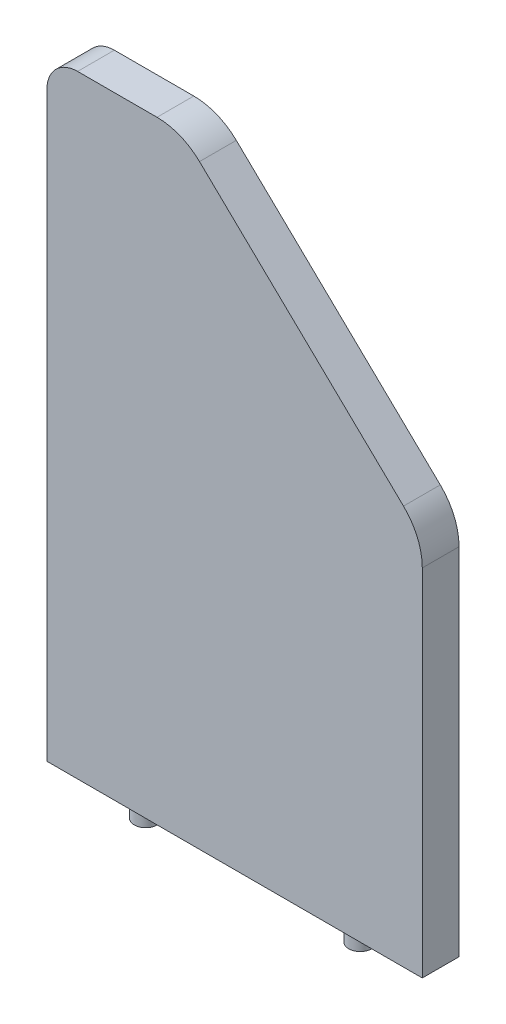
ISO-10303-21;
HEADER;
FILE_DESCRIPTION(('STEP AP214'),'2;1');
FILE_NAME('part.step','',(''),(''),'','','');
FILE_SCHEMA(('AUTOMOTIVE_DESIGN { 1 0 10303 214 1 1 1 1 }'));
ENDSEC;
DATA;
#1=APPLICATION_CONTEXT('core data for automotive mechanical design processes');
#2=APPLICATION_PROTOCOL_DEFINITION('international standard','automotive_design',2000,#1);
#3=PRODUCT_CONTEXT('',#1,'mechanical');
#4=PRODUCT('Part','Part','',(#3));
#5=PRODUCT_RELATED_PRODUCT_CATEGORY('part','',(#4));
#6=PRODUCT_DEFINITION_FORMATION('','',#4);
#7=PRODUCT_DEFINITION_CONTEXT('part definition',#1,'design');
#8=PRODUCT_DEFINITION('design','',#6,#7);
#9=PRODUCT_DEFINITION_SHAPE('','',#8);
#10=(LENGTH_UNIT() NAMED_UNIT(*) SI_UNIT(.MILLI.,.METRE.));
#11=(NAMED_UNIT(*) PLANE_ANGLE_UNIT() SI_UNIT($,.RADIAN.));
#12=(NAMED_UNIT(*) SI_UNIT($,.STERADIAN.) SOLID_ANGLE_UNIT());
#13=UNCERTAINTY_MEASURE_WITH_UNIT(LENGTH_MEASURE(1.E-05),#10,'distance_accuracy_value','');
#14=(GEOMETRIC_REPRESENTATION_CONTEXT(3) GLOBAL_UNCERTAINTY_ASSIGNED_CONTEXT((#13)) GLOBAL_UNIT_ASSIGNED_CONTEXT((#10,
#11,#12)) REPRESENTATION_CONTEXT('',''));
#15=CARTESIAN_POINT('',(0.,0.,0.));
#16=DIRECTION('',(0.,0.,1.));
#17=DIRECTION('',(1.,0.,0.));
#18=AXIS2_PLACEMENT_3D('',#15,#16,#17);
#19=CARTESIAN_POINT('',(5.65255069977418,8.93097875919951,11.4));
#20=DIRECTION('',(0.,1.,0.));
#21=DIRECTION('',(0.,0.,1.));
#22=AXIS2_PLACEMENT_3D('',#19,#20,#21);
#23=PLANE('',#22);
#24=CARTESIAN_POINT('',(29.2775506997742,8.93097875919951,6.));
#25=DIRECTION('',(0.,1.,0.));
#26=DIRECTION('',(0.,0.,1.));
#27=AXIS2_PLACEMENT_3D('',#24,#25,#26);
#28=CIRCLE('',#27,3.375);
#29=CARTESIAN_POINT('',(29.2775506997742,8.93097875919951,9.375));
#30=VERTEX_POINT('',#29);
#31=EDGE_CURVE('E42',#30,#30,#28,.F.);
#32=ORIENTED_EDGE('',*,*,#31,.F.);
#33=EDGE_LOOP('',(#32));
#34=FACE_BOUND('',#33,.T.);
#35=DIRECTION('',(1.,0.,0.));
#36=VECTOR('',#35,1.);
#37=CARTESIAN_POINT('',(5.65255069977418,8.93097875919951,0.6));
#38=LINE('',#37,#36);
#39=CARTESIAN_POINT('',(5.65255069977418,8.93097875919951,0.6));
#40=VERTEX_POINT('',#39);
#41=CARTESIAN_POINT('',(115.902550699774,8.93097875919951,0.6));
#42=VERTEX_POINT('',#41);
#43=EDGE_CURVE('E157',#40,#42,#38,.T.);
#44=ORIENTED_EDGE('',*,*,#43,.T.);
#45=DIRECTION('',(0.,0.,-1.));
#46=VECTOR('',#45,1.);
#47=CARTESIAN_POINT('',(115.902550699774,8.93097875919951,11.4));
#48=LINE('',#47,#46);
#49=CARTESIAN_POINT('',(115.902550699774,8.93097875919951,11.4));
#50=VERTEX_POINT('',#49);
#51=EDGE_CURVE('E155',#50,#42,#48,.T.);
#52=ORIENTED_EDGE('',*,*,#51,.F.);
#53=DIRECTION('',(1.,0.,0.));
#54=VECTOR('',#53,1.);
#55=CARTESIAN_POINT('',(5.65255069977418,8.93097875919951,11.4));
#56=LINE('',#55,#54);
#57=CARTESIAN_POINT('',(5.65255069977418,8.93097875919951,11.4));
#58=VERTEX_POINT('',#57);
#59=EDGE_CURVE('E147',#58,#50,#56,.T.);
#60=ORIENTED_EDGE('',*,*,#59,.F.);
#61=DIRECTION('',(0.,0.,-1.));
#62=VECTOR('',#61,1.);
#63=CARTESIAN_POINT('',(5.65255069977418,8.93097875919951,11.4));
#64=LINE('',#63,#62);
#65=EDGE_CURVE('E165',#58,#40,#64,.T.);
#66=ORIENTED_EDGE('',*,*,#65,.T.);
#67=EDGE_LOOP('',(#44,#52,#60,#66));
#68=FACE_BOUND('',#67,.T.);
#69=CARTESIAN_POINT('',(92.2775506997742,8.93097875919951,6.));
#70=DIRECTION('',(0.,1.,0.));
#71=DIRECTION('',(0.,0.,1.));
#72=AXIS2_PLACEMENT_3D('',#69,#70,#71);
#73=CIRCLE('',#72,3.37500000000001);
#74=CARTESIAN_POINT('',(92.2775506997742,8.93097875919951,9.37500000000001));
#75=VERTEX_POINT('',#74);
#76=EDGE_CURVE('E11',#75,#75,#73,.F.);
#77=ORIENTED_EDGE('',*,*,#76,.F.);
#78=EDGE_LOOP('',(#77));
#79=FACE_BOUND('',#78,.T.);
#80=ADVANCED_FACE('F34',(#34,#68,#79),#23,.F.);
#81=CARTESIAN_POINT('',(5.65255069977418,8.93097875919951,11.4));
#82=DIRECTION('',(1.,0.,0.));
#83=DIRECTION('',(0.,0.,-1.));
#84=AXIS2_PLACEMENT_3D('',#81,#82,#83);
#85=PLANE('',#84);
#86=CARTESIAN_POINT('',(5.65255069977418,17.9309787591995,6.));
#87=DIRECTION('',(-1.,0.,0.));
#88=DIRECTION('',(0.,0.,1.));
#89=AXIS2_PLACEMENT_3D('',#86,#87,#88);
#90=CIRCLE('',#89,2.24999999999999);
#91=CARTESIAN_POINT('',(5.65255069977418,17.9309787591995,8.24999999999999));
#92=VERTEX_POINT('',#91);
#93=EDGE_CURVE('E122',#92,#92,#90,.T.);
#94=ORIENTED_EDGE('',*,*,#93,.F.);
#95=EDGE_LOOP('',(#94));
#96=FACE_BOUND('',#95,.T.);
#97=CARTESIAN_POINT('',(5.65255069977418,170.930978759199,6.));
#98=DIRECTION('',(-1.,0.,0.));
#99=DIRECTION('',(0.,0.,1.));
#100=AXIS2_PLACEMENT_3D('',#97,#98,#99);
#101=CIRCLE('',#100,2.25);
#102=CARTESIAN_POINT('',(5.65255069977418,170.930978759199,8.25));
#103=VERTEX_POINT('',#102);
#104=EDGE_CURVE('E121',#103,#103,#101,.T.);
#105=ORIENTED_EDGE('',*,*,#104,.F.);
#106=EDGE_LOOP('',(#105));
#107=FACE_BOUND('',#106,.T.);
#108=DIRECTION('',(0.,-1.,0.));
#109=VECTOR('',#108,1.);
#110=CARTESIAN_POINT('',(5.65255069977418,8.93097875919951,11.4));
#111=LINE('',#110,#109);
#112=CARTESIAN_POINT('',(5.65255069977418,179.930978759199,11.4));
#113=VERTEX_POINT('',#112);
#114=EDGE_CURVE('E145',#113,#58,#111,.T.);
#115=ORIENTED_EDGE('',*,*,#114,.F.);
#116=DIRECTION('',(0.,0.,-1.));
#117=VECTOR('',#116,1.);
#118=CARTESIAN_POINT('',(5.65255069977418,179.930978759199,11.4));
#119=LINE('',#118,#117);
#120=CARTESIAN_POINT('',(5.65255069977418,179.930978759199,0.6));
#121=VERTEX_POINT('',#120);
#122=EDGE_CURVE('E186',#113,#121,#119,.T.);
#123=ORIENTED_EDGE('',*,*,#122,.T.);
#124=DIRECTION('',(0.,-1.,0.));
#125=VECTOR('',#124,1.);
#126=CARTESIAN_POINT('',(5.65255069977418,8.93097875919951,0.6));
#127=LINE('',#126,#125);
#128=EDGE_CURVE('E142',#121,#40,#127,.T.);
#129=ORIENTED_EDGE('',*,*,#128,.T.);
#130=ORIENTED_EDGE('',*,*,#65,.F.);
#131=EDGE_LOOP('',(#115,#123,#129,#130));
#132=FACE_BOUND('',#131,.T.);
#133=ADVANCED_FACE('F199',(#96,#107,#132),#85,.F.);
#134=CARTESIAN_POINT('',(115.902550699774,8.93097875919951,11.4));
#135=DIRECTION('',(-1.,0.,0.));
#136=DIRECTION('',(0.,0.,1.));
#137=AXIS2_PLACEMENT_3D('',#134,#135,#136);
#138=PLANE('',#137);
#139=DIRECTION('',(0.,1.,0.));
#140=VECTOR('',#139,1.);
#141=CARTESIAN_POINT('',(115.902550699774,8.93097875919951,0.6));
#142=LINE('',#141,#140);
#143=CARTESIAN_POINT('',(115.902550699774,113.248090971298,0.6));
#144=VERTEX_POINT('',#143);
#145=EDGE_CURVE('E159',#42,#144,#142,.T.);
#146=ORIENTED_EDGE('',*,*,#145,.T.);
#147=DIRECTION('',(0.,0.,1.));
#148=VECTOR('',#147,1.);
#149=CARTESIAN_POINT('',(115.902550699774,113.248090971298,11.4));
#150=LINE('',#149,#148);
#151=CARTESIAN_POINT('',(115.902550699774,113.248090971298,11.4));
#152=VERTEX_POINT('',#151);
#153=EDGE_CURVE('E177',#144,#152,#150,.T.);
#154=ORIENTED_EDGE('',*,*,#153,.T.);
#155=DIRECTION('',(0.,1.,0.));
#156=VECTOR('',#155,1.);
#157=CARTESIAN_POINT('',(115.902550699774,8.93097875919951,11.4));
#158=LINE('',#157,#156);
#159=EDGE_CURVE('E150',#50,#152,#158,.T.);
#160=ORIENTED_EDGE('',*,*,#159,.F.);
#161=ORIENTED_EDGE('',*,*,#51,.T.);
#162=EDGE_LOOP('',(#146,#154,#160,#161));
#163=FACE_BOUND('',#162,.T.);
#164=ADVANCED_FACE('F238',(#163),#138,.F.);
#165=CARTESIAN_POINT('',(5.65255069977418,188.9309787592,11.4));
#166=DIRECTION('',(0.,-1.,0.));
#167=DIRECTION('',(0.,0.,-1.));
#168=AXIS2_PLACEMENT_3D('',#165,#166,#167);
#169=PLANE('',#168);
#170=DIRECTION('',(-1.,0.,0.));
#171=VECTOR('',#170,1.);
#172=CARTESIAN_POINT('',(5.65255069977418,188.9309787592,0.6));
#173=LINE('',#172,#171);
#174=CARTESIAN_POINT('',(37.9836037509031,188.9309787592,0.6));
#175=VERTEX_POINT('',#174);
#176=CARTESIAN_POINT('',(14.6525506997742,188.9309787592,0.6));
#177=VERTEX_POINT('',#176);
#178=EDGE_CURVE('E148',#175,#177,#173,.T.);
#179=ORIENTED_EDGE('',*,*,#178,.T.);
#180=DIRECTION('',(0.,0.,-1.));
#181=VECTOR('',#180,1.);
#182=CARTESIAN_POINT('',(14.6525506997742,188.9309787592,11.4));
#183=LINE('',#182,#181);
#184=CARTESIAN_POINT('',(14.6525506997742,188.9309787592,11.4));
#185=VERTEX_POINT('',#184);
#186=EDGE_CURVE('E49',#177,#185,#183,.F.);
#187=ORIENTED_EDGE('',*,*,#186,.T.);
#188=DIRECTION('',(-1.,0.,0.));
#189=VECTOR('',#188,1.);
#190=CARTESIAN_POINT('',(5.65255069977418,188.9309787592,11.4));
#191=LINE('',#190,#189);
#192=CARTESIAN_POINT('',(37.9836037509031,188.9309787592,11.4));
#193=VERTEX_POINT('',#192);
#194=EDGE_CURVE('E153',#193,#185,#191,.T.);
#195=ORIENTED_EDGE('',*,*,#194,.F.);
#196=DIRECTION('',(0.,0.,1.));
#197=VECTOR('',#196,1.);
#198=CARTESIAN_POINT('',(37.9836037509031,188.9309787592,11.4));
#199=LINE('',#198,#197);
#200=EDGE_CURVE('E173',#193,#175,#199,.F.);
#201=ORIENTED_EDGE('',*,*,#200,.T.);
#202=EDGE_LOOP('',(#179,#187,#195,#201));
#203=FACE_BOUND('',#202,.T.);
#204=ADVANCED_FACE('F232',(#203),#169,.F.);
#205=CARTESIAN_POINT('',(5.65255069977418,8.93097875919951,11.4));
#206=DIRECTION('',(0.,0.,-1.));
#207=DIRECTION('',(-1.,0.,0.));
#208=AXIS2_PLACEMENT_3D('',#205,#206,#207);
#209=PLANE('',#208);
#210=ORIENTED_EDGE('',*,*,#194,.T.);
#211=CARTESIAN_POINT('',(14.6525506997742,179.930978759199,11.4));
#212=DIRECTION('',(0.,0.,-1.));
#213=DIRECTION('',(-1.,0.,0.));
#214=AXIS2_PLACEMENT_3D('',#211,#212,#213);
#215=CIRCLE('',#214,9.);
#216=EDGE_CURVE('E191',#185,#113,#215,.F.);
#217=ORIENTED_EDGE('',*,*,#216,.T.);
#218=ORIENTED_EDGE('',*,*,#114,.T.);
#219=ORIENTED_EDGE('',*,*,#59,.T.);
#220=ORIENTED_EDGE('',*,*,#159,.T.);
#221=CARTESIAN_POINT('',(97.9025506997742,113.248090971298,11.4));
#222=DIRECTION('',(0.,0.,-1.));
#223=DIRECTION('',(-1.,0.,0.));
#224=AXIS2_PLACEMENT_3D('',#221,#222,#223);
#225=CIRCLE('',#224,18.);
#226=CARTESIAN_POINT('',(110.38621007177,126.215675506746,11.4));
#227=VERTEX_POINT('',#226);
#228=EDGE_CURVE('E180',#152,#227,#225,.F.);
#229=ORIENTED_EDGE('',*,*,#228,.T.);
#230=DIRECTION('',(0.720421363080441,-0.693536631777528,0.));
#231=VECTOR('',#230,1.);
#232=CARTESIAN_POINT('',(45.2397676418486,188.9309787592,11.4));
#233=LINE('',#232,#231);
#234=CARTESIAN_POINT('',(50.4672631228986,183.898563294647,11.4));
#235=VERTEX_POINT('',#234);
#236=EDGE_CURVE('E138',#235,#227,#233,.T.);
#237=ORIENTED_EDGE('',*,*,#236,.F.);
#238=CARTESIAN_POINT('',(37.9836037509031,170.9309787592,11.4));
#239=DIRECTION('',(0.,0.,-1.));
#240=DIRECTION('',(-1.,0.,0.));
#241=AXIS2_PLACEMENT_3D('',#238,#239,#240);
#242=CIRCLE('',#241,18.);
#243=EDGE_CURVE('E171',#235,#193,#242,.F.);
#244=ORIENTED_EDGE('',*,*,#243,.T.);
#245=EDGE_LOOP('',(#210,#217,#218,#219,#220,#229,#237,#244));
#246=FACE_BOUND('',#245,.T.);
#247=ADVANCED_FACE('F229',(#246),#209,.F.);
#248=CARTESIAN_POINT('',(5.65255069977418,8.93097875919951,0.6));
#249=DIRECTION('',(0.,0.,-1.));
#250=DIRECTION('',(-1.,0.,0.));
#251=AXIS2_PLACEMENT_3D('',#248,#249,#250);
#252=PLANE('',#251);
#253=ORIENTED_EDGE('',*,*,#128,.F.);
#254=CARTESIAN_POINT('',(14.6525506997742,179.930978759199,0.6));
#255=DIRECTION('',(0.,0.,-1.));
#256=DIRECTION('',(-1.,0.,0.));
#257=AXIS2_PLACEMENT_3D('',#254,#255,#256);
#258=CIRCLE('',#257,9.);
#259=EDGE_CURVE('E57',#121,#177,#258,.T.);
#260=ORIENTED_EDGE('',*,*,#259,.T.);
#261=ORIENTED_EDGE('',*,*,#178,.F.);
#262=CARTESIAN_POINT('',(37.9836037509031,170.9309787592,0.6));
#263=DIRECTION('',(0.,0.,-1.));
#264=DIRECTION('',(-1.,0.,0.));
#265=AXIS2_PLACEMENT_3D('',#262,#263,#264);
#266=CIRCLE('',#265,18.);
#267=CARTESIAN_POINT('',(50.4672631228986,183.898563294647,0.6));
#268=VERTEX_POINT('',#267);
#269=EDGE_CURVE('E175',#175,#268,#266,.T.);
#270=ORIENTED_EDGE('',*,*,#269,.T.);
#271=DIRECTION('',(0.720421363080441,-0.693536631777528,0.));
#272=VECTOR('',#271,1.);
#273=CARTESIAN_POINT('',(45.2397676418486,188.9309787592,0.6));
#274=LINE('',#273,#272);
#275=CARTESIAN_POINT('',(110.38621007177,126.215675506746,0.6));
#276=VERTEX_POINT('',#275);
#277=EDGE_CURVE('E139',#268,#276,#274,.T.);
#278=ORIENTED_EDGE('',*,*,#277,.T.);
#279=CARTESIAN_POINT('',(97.9025506997742,113.248090971298,0.6));
#280=DIRECTION('',(0.,0.,-1.));
#281=DIRECTION('',(-1.,0.,0.));
#282=AXIS2_PLACEMENT_3D('',#279,#280,#281);
#283=CIRCLE('',#282,18.);
#284=EDGE_CURVE('E184',#276,#144,#283,.T.);
#285=ORIENTED_EDGE('',*,*,#284,.T.);
#286=ORIENTED_EDGE('',*,*,#145,.F.);
#287=ORIENTED_EDGE('',*,*,#43,.F.);
#288=EDGE_LOOP('',(#253,#260,#261,#270,#278,#285,#286,#287));
#289=FACE_BOUND('',#288,.T.);
#290=ADVANCED_FACE('F227',(#289),#252,.T.);
#291=CARTESIAN_POINT('',(45.2397676418486,188.9309787592,0.6));
#292=DIRECTION('',(-0.693536631777528,-0.720421363080441,0.));
#293=DIRECTION('',(0.720421363080441,-0.693536631777528,0.));
#294=AXIS2_PLACEMENT_3D('',#291,#292,#293);
#295=PLANE('',#294);
#296=ORIENTED_EDGE('',*,*,#236,.T.);
#297=DIRECTION('',(0.,0.,1.));
#298=VECTOR('',#297,1.);
#299=CARTESIAN_POINT('',(110.38621007177,126.215675506746,0.6));
#300=LINE('',#299,#298);
#301=EDGE_CURVE('E182',#227,#276,#300,.F.);
#302=ORIENTED_EDGE('',*,*,#301,.T.);
#303=ORIENTED_EDGE('',*,*,#277,.F.);
#304=DIRECTION('',(0.,0.,1.));
#305=VECTOR('',#304,1.);
#306=CARTESIAN_POINT('',(50.4672631228986,183.898563294647,0.6));
#307=LINE('',#306,#305);
#308=EDGE_CURVE('E168',#268,#235,#307,.T.);
#309=ORIENTED_EDGE('',*,*,#308,.T.);
#310=EDGE_LOOP('',(#296,#302,#303,#309));
#311=FACE_BOUND('',#310,.T.);
#312=ADVANCED_FACE('F223',(#311),#295,.F.);
#313=CARTESIAN_POINT('',(37.9836037509031,170.9309787592,0.6));
#314=DIRECTION('',(0.,0.,1.));
#315=DIRECTION('',(1.,0.,0.));
#316=AXIS2_PLACEMENT_3D('',#313,#314,#315);
#317=CYLINDRICAL_SURFACE('',#316,18.);
#318=ORIENTED_EDGE('',*,*,#269,.F.);
#319=ORIENTED_EDGE('',*,*,#200,.F.);
#320=ORIENTED_EDGE('',*,*,#243,.F.);
#321=ORIENTED_EDGE('',*,*,#308,.F.);
#322=EDGE_LOOP('',(#318,#319,#320,#321));
#323=FACE_BOUND('',#322,.T.);
#324=ADVANCED_FACE('F226',(#323),#317,.T.);
#325=CARTESIAN_POINT('',(97.9025506997742,113.248090971298,11.4));
#326=DIRECTION('',(0.,0.,1.));
#327=DIRECTION('',(1.,0.,0.));
#328=AXIS2_PLACEMENT_3D('',#325,#326,#327);
#329=CYLINDRICAL_SURFACE('',#328,18.);
#330=ORIENTED_EDGE('',*,*,#284,.F.);
#331=ORIENTED_EDGE('',*,*,#301,.F.);
#332=ORIENTED_EDGE('',*,*,#228,.F.);
#333=ORIENTED_EDGE('',*,*,#153,.F.);
#334=EDGE_LOOP('',(#330,#331,#332,#333));
#335=FACE_BOUND('',#334,.T.);
#336=ADVANCED_FACE('F246',(#335),#329,.T.);
#337=CARTESIAN_POINT('',(14.6525506997742,179.930978759199,11.4));
#338=DIRECTION('',(0.,0.,-1.));
#339=DIRECTION('',(-1.,0.,0.));
#340=AXIS2_PLACEMENT_3D('',#337,#338,#339);
#341=CYLINDRICAL_SURFACE('',#340,9.);
#342=ORIENTED_EDGE('',*,*,#216,.F.);
#343=ORIENTED_EDGE('',*,*,#186,.F.);
#344=ORIENTED_EDGE('',*,*,#259,.F.);
#345=ORIENTED_EDGE('',*,*,#122,.F.);
#346=EDGE_LOOP('',(#342,#343,#344,#345));
#347=FACE_BOUND('',#346,.T.);
#348=ADVANCED_FACE('F36',(#347),#341,.T.);
#349=CARTESIAN_POINT('',(29.2775506997742,3.53097875919951,6.));
#350=DIRECTION('',(0.,1.,0.));
#351=DIRECTION('',(0.,0.,1.));
#352=AXIS2_PLACEMENT_3D('',#349,#350,#351);
#353=CYLINDRICAL_SURFACE('',#352,3.375);
#354=CARTESIAN_POINT('',(29.2775506997742,3.53097875919951,6.));
#355=DIRECTION('',(0.,-1.,0.));
#356=DIRECTION('',(0.,0.,-1.));
#357=AXIS2_PLACEMENT_3D('',#354,#355,#356);
#358=CIRCLE('',#357,3.375);
#359=CARTESIAN_POINT('',(29.2775506997742,3.53097875919951,2.625));
#360=VERTEX_POINT('',#359);
#361=EDGE_CURVE('E135',#360,#360,#358,.T.);
#362=ORIENTED_EDGE('',*,*,#361,.F.);
#363=EDGE_LOOP('',(#362));
#364=FACE_BOUND('',#363,.T.);
#365=ORIENTED_EDGE('',*,*,#31,.T.);
#366=EDGE_LOOP('',(#365));
#367=FACE_BOUND('',#366,.T.);
#368=ADVANCED_FACE('F195',(#364,#367),#353,.T.);
#369=CARTESIAN_POINT('',(92.2775506997742,3.53097875919951,6.));
#370=DIRECTION('',(0.,1.,0.));
#371=DIRECTION('',(0.,0.,1.));
#372=AXIS2_PLACEMENT_3D('',#369,#370,#371);
#373=CYLINDRICAL_SURFACE('',#372,3.37500000000001);
#374=CARTESIAN_POINT('',(92.2775506997742,3.53097875919951,6.));
#375=DIRECTION('',(0.,-1.,0.));
#376=DIRECTION('',(0.,0.,-1.));
#377=AXIS2_PLACEMENT_3D('',#374,#375,#376);
#378=CIRCLE('',#377,3.37500000000001);
#379=CARTESIAN_POINT('',(92.2775506997742,3.53097875919951,2.62499999999999));
#380=VERTEX_POINT('',#379);
#381=EDGE_CURVE('E132',#380,#380,#378,.T.);
#382=ORIENTED_EDGE('',*,*,#381,.F.);
#383=EDGE_LOOP('',(#382));
#384=FACE_BOUND('',#383,.T.);
#385=ORIENTED_EDGE('',*,*,#76,.T.);
#386=EDGE_LOOP('',(#385));
#387=FACE_BOUND('',#386,.T.);
#388=ADVANCED_FACE('F206',(#384,#387),#373,.T.);
#389=CARTESIAN_POINT('',(29.2775506997742,3.53097875919951,6.));
#390=DIRECTION('',(0.,1.,0.));
#391=DIRECTION('',(0.,0.,-1.));
#392=AXIS2_PLACEMENT_3D('',#389,#390,#391);
#393=CONICAL_SURFACE('',#392,3.375,1.08210413623649);
#394=CARTESIAN_POINT('',(29.2775506997742,1.73645942734203,6.));
#395=VERTEX_POINT('',#394);
#396=VERTEX_LOOP('',#395);
#397=FACE_BOUND('',#396,.T.);
#398=ORIENTED_EDGE('',*,*,#361,.T.);
#399=EDGE_LOOP('',(#398));
#400=FACE_BOUND('',#399,.T.);
#401=ADVANCED_FACE('F208',(#397,#400),#393,.T.);
#402=CARTESIAN_POINT('',(92.2775506997742,3.53097875919951,6.));
#403=DIRECTION('',(0.,1.,0.));
#404=DIRECTION('',(0.,0.,-1.));
#405=AXIS2_PLACEMENT_3D('',#402,#403,#404);
#406=CONICAL_SURFACE('',#405,3.37500000000001,1.08210413623649);
#407=CARTESIAN_POINT('',(92.2775506997742,1.73645942734202,6.));
#408=VERTEX_POINT('',#407);
#409=VERTEX_LOOP('',#408);
#410=FACE_BOUND('',#409,.T.);
#411=ORIENTED_EDGE('',*,*,#381,.T.);
#412=EDGE_LOOP('',(#411));
#413=FACE_BOUND('',#412,.T.);
#414=ADVANCED_FACE('F215',(#410,#413),#406,.T.);
#415=CARTESIAN_POINT('',(12.8525506997742,170.930978759199,6.));
#416=DIRECTION('',(-1.,0.,0.));
#417=DIRECTION('',(0.,0.,1.));
#418=AXIS2_PLACEMENT_3D('',#415,#416,#417);
#419=CONICAL_SURFACE('',#418,2.24999999999998,1.02974425867665);
#420=CARTESIAN_POINT('',(14.2044870925862,170.930978759199,6.));
#421=VERTEX_POINT('',#420);
#422=VERTEX_LOOP('',#421);
#423=FACE_BOUND('',#422,.T.);
#424=CARTESIAN_POINT('',(12.8525506997742,170.930978759199,6.));
#425=DIRECTION('',(-1.,0.,0.));
#426=DIRECTION('',(0.,0.,1.));
#427=AXIS2_PLACEMENT_3D('',#424,#425,#426);
#428=CIRCLE('',#427,2.24999999999998);
#429=CARTESIAN_POINT('',(12.8525506997742,170.930978759199,8.24999999999998));
#430=VERTEX_POINT('',#429);
#431=EDGE_CURVE('E125',#430,#430,#428,.T.);
#432=ORIENTED_EDGE('',*,*,#431,.T.);
#433=EDGE_LOOP('',(#432));
#434=FACE_BOUND('',#433,.T.);
#435=ADVANCED_FACE('F296',(#423,#434),#419,.F.);
#436=CARTESIAN_POINT('',(5.65255069977418,170.930978759199,6.));
#437=DIRECTION('',(-1.,0.,0.));
#438=DIRECTION('',(0.,0.,1.));
#439=AXIS2_PLACEMENT_3D('',#436,#437,#438);
#440=CYLINDRICAL_SURFACE('',#439,2.24999999999999);
#441=ORIENTED_EDGE('',*,*,#431,.F.);
#442=EDGE_LOOP('',(#441));
#443=FACE_BOUND('',#442,.T.);
#444=ORIENTED_EDGE('',*,*,#104,.T.);
#445=EDGE_LOOP('',(#444));
#446=FACE_BOUND('',#445,.T.);
#447=ADVANCED_FACE('F115',(#443,#446),#440,.F.);
#448=CARTESIAN_POINT('',(12.8525506997742,17.9309787591995,6.));
#449=DIRECTION('',(-1.,0.,0.));
#450=DIRECTION('',(0.,0.,1.));
#451=AXIS2_PLACEMENT_3D('',#448,#449,#450);
#452=CONICAL_SURFACE('',#451,2.24999999999999,1.02974425867665);
#453=CARTESIAN_POINT('',(14.2044870925862,17.9309787591995,6.));
#454=VERTEX_POINT('',#453);
#455=VERTEX_LOOP('',#454);
#456=FACE_BOUND('',#455,.T.);
#457=CARTESIAN_POINT('',(12.8525506997742,17.9309787591995,6.));
#458=DIRECTION('',(-1.,0.,0.));
#459=DIRECTION('',(0.,0.,1.));
#460=AXIS2_PLACEMENT_3D('',#457,#458,#459);
#461=CIRCLE('',#460,2.24999999999999);
#462=CARTESIAN_POINT('',(12.8525506997742,17.9309787591995,8.24999999999999));
#463=VERTEX_POINT('',#462);
#464=EDGE_CURVE('E119',#463,#463,#461,.T.);
#465=ORIENTED_EDGE('',*,*,#464,.T.);
#466=EDGE_LOOP('',(#465));
#467=FACE_BOUND('',#466,.T.);
#468=ADVANCED_FACE('F111',(#456,#467),#452,.F.);
#469=CARTESIAN_POINT('',(5.65255069977418,17.9309787591995,6.));
#470=DIRECTION('',(-1.,0.,0.));
#471=DIRECTION('',(0.,0.,1.));
#472=AXIS2_PLACEMENT_3D('',#469,#470,#471);
#473=CYLINDRICAL_SURFACE('',#472,2.24999999999999);
#474=ORIENTED_EDGE('',*,*,#464,.F.);
#475=EDGE_LOOP('',(#474));
#476=FACE_BOUND('',#475,.T.);
#477=ORIENTED_EDGE('',*,*,#93,.T.);
#478=EDGE_LOOP('',(#477));
#479=FACE_BOUND('',#478,.T.);
#480=ADVANCED_FACE('F114',(#476,#479),#473,.F.);
#481=CLOSED_SHELL('',(#80,#133,#164,#204,#247,#290,#312,#324,#336,#348,#368,#388,#401,#414,#435,
#447,#468,#480));
#482=MANIFOLD_SOLID_BREP('B2',#481);
#483=ADVANCED_BREP_SHAPE_REPRESENTATION('',(#18,#482),#14);
#484=SHAPE_DEFINITION_REPRESENTATION(#9,#483);
ENDSEC;
END-ISO-10303-21;
